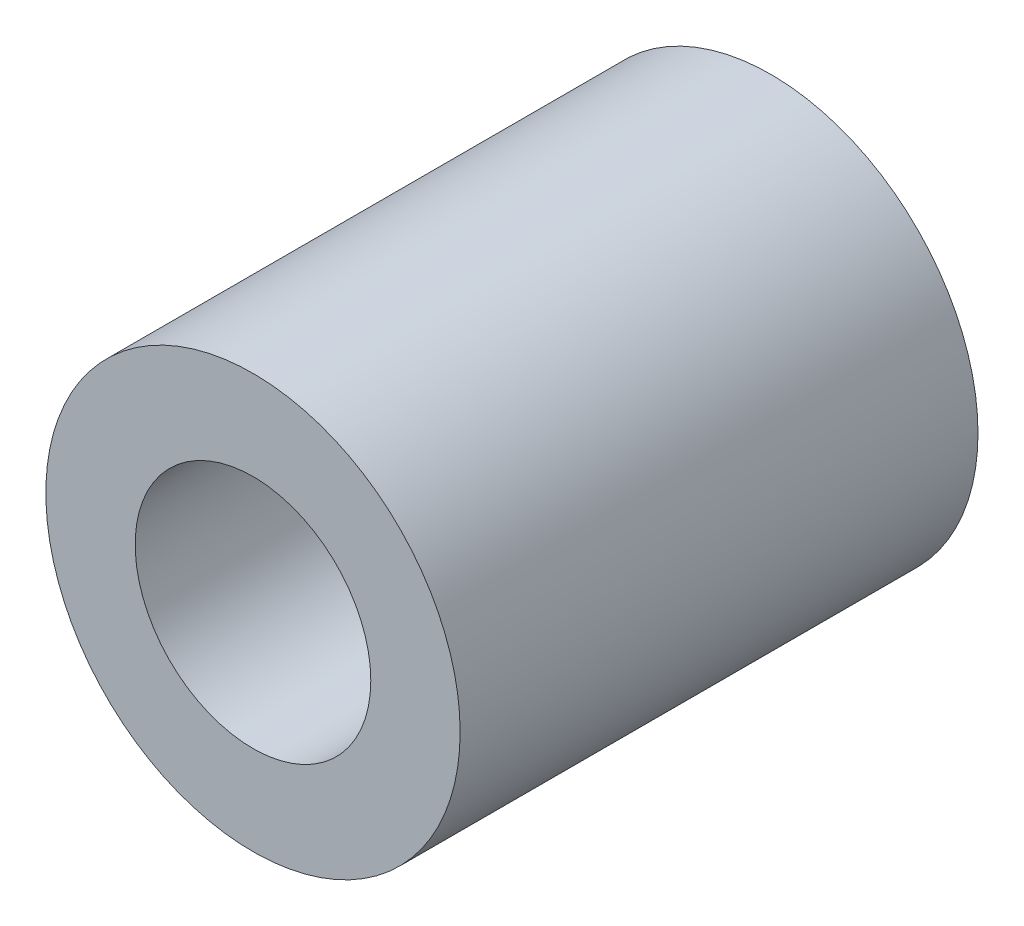
ISO-10303-21;
HEADER;
FILE_DESCRIPTION(('STEP AP214'),'2;1');
FILE_NAME('part.step','',(''),(''),'','','');
FILE_SCHEMA(('AUTOMOTIVE_DESIGN { 1 0 10303 214 1 1 1 1 }'));
ENDSEC;
DATA;
#1=APPLICATION_CONTEXT('core data for automotive mechanical design processes');
#2=APPLICATION_PROTOCOL_DEFINITION('international standard','automotive_design',2000,#1);
#3=PRODUCT_CONTEXT('',#1,'mechanical');
#4=PRODUCT('Part','Part','',(#3));
#5=PRODUCT_RELATED_PRODUCT_CATEGORY('part','',(#4));
#6=PRODUCT_DEFINITION_FORMATION('','',#4);
#7=PRODUCT_DEFINITION_CONTEXT('part definition',#1,'design');
#8=PRODUCT_DEFINITION('design','',#6,#7);
#9=PRODUCT_DEFINITION_SHAPE('','',#8);
#10=(LENGTH_UNIT() NAMED_UNIT(*) SI_UNIT(.MILLI.,.METRE.));
#11=(NAMED_UNIT(*) PLANE_ANGLE_UNIT() SI_UNIT($,.RADIAN.));
#12=(NAMED_UNIT(*) SI_UNIT($,.STERADIAN.) SOLID_ANGLE_UNIT());
#13=UNCERTAINTY_MEASURE_WITH_UNIT(LENGTH_MEASURE(1.E-05),#10,'distance_accuracy_value','');
#14=(GEOMETRIC_REPRESENTATION_CONTEXT(3) GLOBAL_UNCERTAINTY_ASSIGNED_CONTEXT((#13)) GLOBAL_UNIT_ASSIGNED_CONTEXT((#10,
#11,#12)) REPRESENTATION_CONTEXT('',''));
#15=CARTESIAN_POINT('',(0.,0.,0.));
#16=DIRECTION('',(0.,0.,1.));
#17=DIRECTION('',(1.,0.,0.));
#18=AXIS2_PLACEMENT_3D('',#15,#16,#17);
#19=CARTESIAN_POINT('',(0.,0.,10.));
#20=DIRECTION('',(0.,0.,1.));
#21=DIRECTION('',(1.,0.,0.));
#22=AXIS2_PLACEMENT_3D('',#19,#20,#21);
#23=PLANE('',#22);
#24=CARTESIAN_POINT('',(0.,0.,10.));
#25=DIRECTION('',(0.,0.,1.));
#26=DIRECTION('',(1.,0.,0.));
#27=AXIS2_PLACEMENT_3D('',#24,#25,#26);
#28=CIRCLE('',#27,4.);
#29=CARTESIAN_POINT('',(4.,0.,10.));
#30=VERTEX_POINT('',#29);
#31=EDGE_CURVE('E10',#30,#30,#28,.T.);
#32=ORIENTED_EDGE('',*,*,#31,.T.);
#33=EDGE_LOOP('',(#32));
#34=FACE_BOUND('',#33,.T.);
#35=CARTESIAN_POINT('',(0.,0.,10.));
#36=DIRECTION('',(0.,0.,1.));
#37=DIRECTION('',(1.,0.,0.));
#38=AXIS2_PLACEMENT_3D('',#35,#36,#37);
#39=CIRCLE('',#38,2.275);
#40=CARTESIAN_POINT('',(2.275,0.,10.));
#41=VERTEX_POINT('',#40);
#42=EDGE_CURVE('E42',#41,#41,#39,.T.);
#43=ORIENTED_EDGE('',*,*,#42,.F.);
#44=EDGE_LOOP('',(#43));
#45=FACE_BOUND('',#44,.T.);
#46=ADVANCED_FACE('F31',(#34,#45),#23,.T.);
#47=CARTESIAN_POINT('',(0.,0.,0.));
#48=DIRECTION('',(0.,0.,1.));
#49=DIRECTION('',(1.,0.,0.));
#50=AXIS2_PLACEMENT_3D('',#47,#48,#49);
#51=PLANE('',#50);
#52=CARTESIAN_POINT('',(0.,0.,0.));
#53=DIRECTION('',(0.,0.,1.));
#54=DIRECTION('',(1.,0.,0.));
#55=AXIS2_PLACEMENT_3D('',#52,#53,#54);
#56=CIRCLE('',#55,4.);
#57=CARTESIAN_POINT('',(4.,0.,0.));
#58=VERTEX_POINT('',#57);
#59=EDGE_CURVE('E35',#58,#58,#56,.T.);
#60=ORIENTED_EDGE('',*,*,#59,.F.);
#61=EDGE_LOOP('',(#60));
#62=FACE_BOUND('',#61,.T.);
#63=CARTESIAN_POINT('',(0.,0.,0.));
#64=DIRECTION('',(0.,0.,1.));
#65=DIRECTION('',(1.,0.,0.));
#66=AXIS2_PLACEMENT_3D('',#63,#64,#65);
#67=CIRCLE('',#66,2.275);
#68=CARTESIAN_POINT('',(2.275,0.,0.));
#69=VERTEX_POINT('',#68);
#70=EDGE_CURVE('E44',#69,#69,#67,.T.);
#71=ORIENTED_EDGE('',*,*,#70,.T.);
#72=EDGE_LOOP('',(#71));
#73=FACE_BOUND('',#72,.T.);
#74=ADVANCED_FACE('F54',(#62,#73),#51,.F.);
#75=CARTESIAN_POINT('',(0.,0.,10.));
#76=DIRECTION('',(0.,0.,-1.));
#77=DIRECTION('',(-1.,0.,0.));
#78=AXIS2_PLACEMENT_3D('',#75,#76,#77);
#79=CYLINDRICAL_SURFACE('',#78,4.);
#80=ORIENTED_EDGE('',*,*,#31,.F.);
#81=EDGE_LOOP('',(#80));
#82=FACE_BOUND('',#81,.T.);
#83=ORIENTED_EDGE('',*,*,#59,.T.);
#84=EDGE_LOOP('',(#83));
#85=FACE_BOUND('',#84,.T.);
#86=ADVANCED_FACE('F33',(#82,#85),#79,.T.);
#87=CARTESIAN_POINT('',(0.,0.,10.));
#88=DIRECTION('',(0.,0.,-1.));
#89=DIRECTION('',(-1.,0.,0.));
#90=AXIS2_PLACEMENT_3D('',#87,#88,#89);
#91=CYLINDRICAL_SURFACE('',#90,2.275);
#92=ORIENTED_EDGE('',*,*,#42,.T.);
#93=EDGE_LOOP('',(#92));
#94=FACE_BOUND('',#93,.T.);
#95=ORIENTED_EDGE('',*,*,#70,.F.);
#96=EDGE_LOOP('',(#95));
#97=FACE_BOUND('',#96,.T.);
#98=ADVANCED_FACE('F50',(#94,#97),#91,.F.);
#99=CLOSED_SHELL('',(#46,#74,#86,#98));
#100=MANIFOLD_SOLID_BREP('B2',#99);
#101=ADVANCED_BREP_SHAPE_REPRESENTATION('',(#18,#100),#14);
#102=SHAPE_DEFINITION_REPRESENTATION(#9,#101);
ENDSEC;
END-ISO-10303-21;
